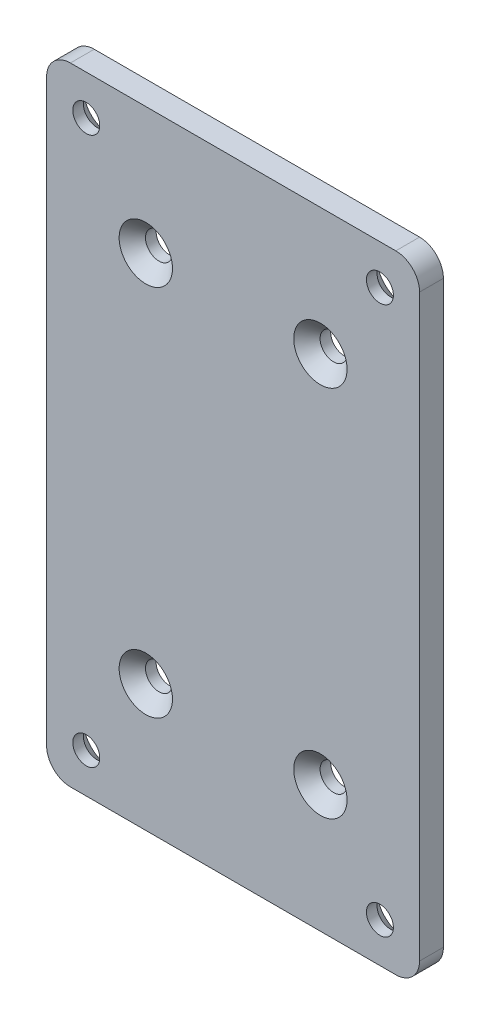
ISO-10303-21;
HEADER;
FILE_DESCRIPTION(('STEP AP214'),'2;1');
FILE_NAME('part.step','',(''),(''),'','','');
FILE_SCHEMA(('AUTOMOTIVE_DESIGN { 1 0 10303 214 1 1 1 1 }'));
ENDSEC;
DATA;
#1=APPLICATION_CONTEXT('core data for automotive mechanical design processes');
#2=APPLICATION_PROTOCOL_DEFINITION('international standard','automotive_design',2000,#1);
#3=PRODUCT_CONTEXT('',#1,'mechanical');
#4=PRODUCT('Part','Part','',(#3));
#5=PRODUCT_RELATED_PRODUCT_CATEGORY('part','',(#4));
#6=PRODUCT_DEFINITION_FORMATION('','',#4);
#7=PRODUCT_DEFINITION_CONTEXT('part definition',#1,'design');
#8=PRODUCT_DEFINITION('design','',#6,#7);
#9=PRODUCT_DEFINITION_SHAPE('','',#8);
#10=(LENGTH_UNIT() NAMED_UNIT(*) SI_UNIT(.MILLI.,.METRE.));
#11=(NAMED_UNIT(*) PLANE_ANGLE_UNIT() SI_UNIT($,.RADIAN.));
#12=(NAMED_UNIT(*) SI_UNIT($,.STERADIAN.) SOLID_ANGLE_UNIT());
#13=UNCERTAINTY_MEASURE_WITH_UNIT(LENGTH_MEASURE(1.E-05),#10,'distance_accuracy_value','');
#14=(GEOMETRIC_REPRESENTATION_CONTEXT(3) GLOBAL_UNCERTAINTY_ASSIGNED_CONTEXT((#13)) GLOBAL_UNIT_ASSIGNED_CONTEXT((#10,
#11,#12)) REPRESENTATION_CONTEXT('',''));
#15=CARTESIAN_POINT('',(0.,0.,0.));
#16=DIRECTION('',(0.,0.,1.));
#17=DIRECTION('',(1.,0.,0.));
#18=AXIS2_PLACEMENT_3D('',#15,#16,#17);
#19=CARTESIAN_POINT('',(23.5,39.5,3.));
#20=DIRECTION('',(-1.,0.,0.));
#21=DIRECTION('',(0.,-1.,0.));
#22=AXIS2_PLACEMENT_3D('',#19,#20,#21);
#23=PLANE('',#22);
#24=DIRECTION('',(0.,1.,0.));
#25=VECTOR('',#24,1.);
#26=CARTESIAN_POINT('',(23.5,39.5,3.));
#27=LINE('',#26,#25);
#28=CARTESIAN_POINT('',(23.5,-36.5,3.));
#29=VERTEX_POINT('',#28);
#30=CARTESIAN_POINT('',(23.5,36.5,3.));
#31=VERTEX_POINT('',#30);
#32=EDGE_CURVE('E129',#29,#31,#27,.T.);
#33=ORIENTED_EDGE('',*,*,#32,.F.);
#34=DIRECTION('',(0.,0.,-1.));
#35=VECTOR('',#34,1.);
#36=CARTESIAN_POINT('',(23.5,-36.5,3.));
#37=LINE('',#36,#35);
#38=CARTESIAN_POINT('',(23.5,-36.5,0.));
#39=VERTEX_POINT('',#38);
#40=EDGE_CURVE('E11',#29,#39,#37,.T.);
#41=ORIENTED_EDGE('',*,*,#40,.T.);
#42=DIRECTION('',(0.,1.,0.));
#43=VECTOR('',#42,1.);
#44=CARTESIAN_POINT('',(23.5,39.5,0.));
#45=LINE('',#44,#43);
#46=CARTESIAN_POINT('',(23.5,36.5,0.));
#47=VERTEX_POINT('',#46);
#48=EDGE_CURVE('E131',#39,#47,#45,.T.);
#49=ORIENTED_EDGE('',*,*,#48,.T.);
#50=DIRECTION('',(0.,0.,-1.));
#51=VECTOR('',#50,1.);
#52=CARTESIAN_POINT('',(23.5,36.5,3.));
#53=LINE('',#52,#51);
#54=EDGE_CURVE('E42',#47,#31,#53,.F.);
#55=ORIENTED_EDGE('',*,*,#54,.T.);
#56=EDGE_LOOP('',(#33,#41,#49,#55));
#57=FACE_BOUND('',#56,.T.);
#58=ADVANCED_FACE('F34',(#57),#23,.F.);
#59=CARTESIAN_POINT('',(-23.5,39.5,3.));
#60=DIRECTION('',(0.,-1.,0.));
#61=DIRECTION('',(0.,0.,-1.));
#62=AXIS2_PLACEMENT_3D('',#59,#60,#61);
#63=PLANE('',#62);
#64=DIRECTION('',(-1.,0.,0.));
#65=VECTOR('',#64,1.);
#66=CARTESIAN_POINT('',(-23.5,39.5,0.));
#67=LINE('',#66,#65);
#68=CARTESIAN_POINT('',(20.5,39.5,0.));
#69=VERTEX_POINT('',#68);
#70=CARTESIAN_POINT('',(-20.5,39.5,0.));
#71=VERTEX_POINT('',#70);
#72=EDGE_CURVE('E127',#69,#71,#67,.T.);
#73=ORIENTED_EDGE('',*,*,#72,.T.);
#74=DIRECTION('',(0.,0.,-1.));
#75=VECTOR('',#74,1.);
#76=CARTESIAN_POINT('',(-20.5,39.5,3.));
#77=LINE('',#76,#75);
#78=CARTESIAN_POINT('',(-20.5,39.5,3.));
#79=VERTEX_POINT('',#78);
#80=EDGE_CURVE('E106',#71,#79,#77,.F.);
#81=ORIENTED_EDGE('',*,*,#80,.T.);
#82=DIRECTION('',(-1.,0.,0.));
#83=VECTOR('',#82,1.);
#84=CARTESIAN_POINT('',(-23.5,39.5,3.));
#85=LINE('',#84,#83);
#86=CARTESIAN_POINT('',(20.5,39.5,3.));
#87=VERTEX_POINT('',#86);
#88=EDGE_CURVE('E167',#87,#79,#85,.T.);
#89=ORIENTED_EDGE('',*,*,#88,.F.);
#90=DIRECTION('',(0.,0.,-1.));
#91=VECTOR('',#90,1.);
#92=CARTESIAN_POINT('',(20.5,39.5,3.));
#93=LINE('',#92,#91);
#94=EDGE_CURVE('E111',#87,#69,#93,.T.);
#95=ORIENTED_EDGE('',*,*,#94,.T.);
#96=EDGE_LOOP('',(#73,#81,#89,#95));
#97=FACE_BOUND('',#96,.T.);
#98=ADVANCED_FACE('F171',(#97),#63,.F.);
#99=CARTESIAN_POINT('',(-23.5,39.5,3.));
#100=DIRECTION('',(1.,0.,0.));
#101=DIRECTION('',(0.,1.,0.));
#102=AXIS2_PLACEMENT_3D('',#99,#100,#101);
#103=PLANE('',#102);
#104=DIRECTION('',(0.,-1.,0.));
#105=VECTOR('',#104,1.);
#106=CARTESIAN_POINT('',(-23.5,39.5,3.));
#107=LINE('',#106,#105);
#108=CARTESIAN_POINT('',(-23.5,36.5,3.));
#109=VERTEX_POINT('',#108);
#110=CARTESIAN_POINT('',(-23.5,-36.5,3.));
#111=VERTEX_POINT('',#110);
#112=EDGE_CURVE('E120',#109,#111,#107,.T.);
#113=ORIENTED_EDGE('',*,*,#112,.F.);
#114=DIRECTION('',(0.,0.,-1.));
#115=VECTOR('',#114,1.);
#116=CARTESIAN_POINT('',(-23.5,36.5,3.));
#117=LINE('',#116,#115);
#118=CARTESIAN_POINT('',(-23.5,36.5,0.));
#119=VERTEX_POINT('',#118);
#120=EDGE_CURVE('E105',#109,#119,#117,.T.);
#121=ORIENTED_EDGE('',*,*,#120,.T.);
#122=DIRECTION('',(0.,-1.,0.));
#123=VECTOR('',#122,1.);
#124=CARTESIAN_POINT('',(-23.5,39.5,0.));
#125=LINE('',#124,#123);
#126=CARTESIAN_POINT('',(-23.5,-36.5,0.));
#127=VERTEX_POINT('',#126);
#128=EDGE_CURVE('E118',#119,#127,#125,.T.);
#129=ORIENTED_EDGE('',*,*,#128,.T.);
#130=DIRECTION('',(0.,0.,-1.));
#131=VECTOR('',#130,1.);
#132=CARTESIAN_POINT('',(-23.5,-36.5,3.));
#133=LINE('',#132,#131);
#134=EDGE_CURVE('E122',#127,#111,#133,.F.);
#135=ORIENTED_EDGE('',*,*,#134,.T.);
#136=EDGE_LOOP('',(#113,#121,#129,#135));
#137=FACE_BOUND('',#136,.T.);
#138=ADVANCED_FACE('F117',(#137),#103,.F.);
#139=CARTESIAN_POINT('',(-23.5,-39.5,3.));
#140=DIRECTION('',(0.,1.,0.));
#141=DIRECTION('',(0.,0.,1.));
#142=AXIS2_PLACEMENT_3D('',#139,#140,#141);
#143=PLANE('',#142);
#144=DIRECTION('',(1.,0.,0.));
#145=VECTOR('',#144,1.);
#146=CARTESIAN_POINT('',(-23.5,-39.5,3.));
#147=LINE('',#146,#145);
#148=CARTESIAN_POINT('',(-20.5,-39.5,3.));
#149=VERTEX_POINT('',#148);
#150=CARTESIAN_POINT('',(20.5,-39.5,3.));
#151=VERTEX_POINT('',#150);
#152=EDGE_CURVE('E135',#149,#151,#147,.T.);
#153=ORIENTED_EDGE('',*,*,#152,.F.);
#154=DIRECTION('',(0.,0.,-1.));
#155=VECTOR('',#154,1.);
#156=CARTESIAN_POINT('',(-20.5,-39.5,3.));
#157=LINE('',#156,#155);
#158=CARTESIAN_POINT('',(-20.5,-39.5,0.));
#159=VERTEX_POINT('',#158);
#160=EDGE_CURVE('E152',#149,#159,#157,.T.);
#161=ORIENTED_EDGE('',*,*,#160,.T.);
#162=DIRECTION('',(1.,0.,0.));
#163=VECTOR('',#162,1.);
#164=CARTESIAN_POINT('',(-23.5,-39.5,0.));
#165=LINE('',#164,#163);
#166=CARTESIAN_POINT('',(20.5,-39.5,0.));
#167=VERTEX_POINT('',#166);
#168=EDGE_CURVE('E126',#159,#167,#165,.T.);
#169=ORIENTED_EDGE('',*,*,#168,.T.);
#170=DIRECTION('',(0.,0.,-1.));
#171=VECTOR('',#170,1.);
#172=CARTESIAN_POINT('',(20.5,-39.5,3.));
#173=LINE('',#172,#171);
#174=EDGE_CURVE('E49',#167,#151,#173,.F.);
#175=ORIENTED_EDGE('',*,*,#174,.T.);
#176=EDGE_LOOP('',(#153,#161,#169,#175));
#177=FACE_BOUND('',#176,.T.);
#178=ADVANCED_FACE('F282',(#177),#143,.F.);
#179=CARTESIAN_POINT('',(0.,0.,3.));
#180=DIRECTION('',(0.,0.,1.));
#181=DIRECTION('',(1.,0.,0.));
#182=AXIS2_PLACEMENT_3D('',#179,#180,#181);
#183=PLANE('',#182);
#184=CARTESIAN_POINT('',(18.5,34.5,3.));
#185=DIRECTION('',(0.,0.,-1.));
#186=DIRECTION('',(-1.,0.,0.));
#187=AXIS2_PLACEMENT_3D('',#184,#185,#186);
#188=CIRCLE('',#187,1.7);
#189=CARTESIAN_POINT('',(16.8,34.5,3.));
#190=VERTEX_POINT('',#189);
#191=EDGE_CURVE('E239',#190,#190,#188,.T.);
#192=ORIENTED_EDGE('',*,*,#191,.T.);
#193=EDGE_LOOP('',(#192));
#194=FACE_BOUND('',#193,.T.);
#195=CARTESIAN_POINT('',(-18.5,34.5,3.));
#196=DIRECTION('',(0.,0.,-1.));
#197=DIRECTION('',(-1.,0.,0.));
#198=AXIS2_PLACEMENT_3D('',#195,#196,#197);
#199=CIRCLE('',#198,1.7);
#200=CARTESIAN_POINT('',(-20.2,34.5,3.));
#201=VERTEX_POINT('',#200);
#202=EDGE_CURVE('E230',#201,#201,#199,.T.);
#203=ORIENTED_EDGE('',*,*,#202,.T.);
#204=EDGE_LOOP('',(#203));
#205=FACE_BOUND('',#204,.T.);
#206=CARTESIAN_POINT('',(18.5,-34.5,3.));
#207=DIRECTION('',(0.,0.,-1.));
#208=DIRECTION('',(-1.,0.,0.));
#209=AXIS2_PLACEMENT_3D('',#206,#207,#208);
#210=CIRCLE('',#209,1.7);
#211=CARTESIAN_POINT('',(16.8,-34.5,3.));
#212=VERTEX_POINT('',#211);
#213=EDGE_CURVE('E221',#212,#212,#210,.T.);
#214=ORIENTED_EDGE('',*,*,#213,.T.);
#215=EDGE_LOOP('',(#214));
#216=FACE_BOUND('',#215,.T.);
#217=CARTESIAN_POINT('',(-18.5,-34.5,3.));
#218=DIRECTION('',(0.,0.,-1.));
#219=DIRECTION('',(-1.,0.,0.));
#220=AXIS2_PLACEMENT_3D('',#217,#218,#219);
#221=CIRCLE('',#220,1.7);
#222=CARTESIAN_POINT('',(-20.2,-34.5,3.));
#223=VERTEX_POINT('',#222);
#224=EDGE_CURVE('E212',#223,#223,#221,.T.);
#225=ORIENTED_EDGE('',*,*,#224,.T.);
#226=EDGE_LOOP('',(#225));
#227=FACE_BOUND('',#226,.T.);
#228=CARTESIAN_POINT('',(-11.,23.5,3.));
#229=DIRECTION('',(0.,0.,1.));
#230=DIRECTION('',(1.,0.,0.));
#231=AXIS2_PLACEMENT_3D('',#228,#229,#230);
#232=CIRCLE('',#231,3.36);
#233=CARTESIAN_POINT('',(-7.64,23.5,3.));
#234=VERTEX_POINT('',#233);
#235=EDGE_CURVE('E209',#234,#234,#232,.T.);
#236=ORIENTED_EDGE('',*,*,#235,.F.);
#237=EDGE_LOOP('',(#236));
#238=FACE_BOUND('',#237,.T.);
#239=CARTESIAN_POINT('',(11.,23.5,3.));
#240=DIRECTION('',(0.,0.,1.));
#241=DIRECTION('',(1.,0.,0.));
#242=AXIS2_PLACEMENT_3D('',#239,#240,#241);
#243=CIRCLE('',#242,3.36);
#244=CARTESIAN_POINT('',(14.36,23.5,3.));
#245=VERTEX_POINT('',#244);
#246=EDGE_CURVE('E200',#245,#245,#243,.T.);
#247=ORIENTED_EDGE('',*,*,#246,.F.);
#248=EDGE_LOOP('',(#247));
#249=FACE_BOUND('',#248,.T.);
#250=CARTESIAN_POINT('',(-11.,-23.5,3.));
#251=DIRECTION('',(0.,0.,1.));
#252=DIRECTION('',(1.,0.,0.));
#253=AXIS2_PLACEMENT_3D('',#250,#251,#252);
#254=CIRCLE('',#253,3.36);
#255=CARTESIAN_POINT('',(-7.64,-23.5,3.));
#256=VERTEX_POINT('',#255);
#257=EDGE_CURVE('E191',#256,#256,#254,.T.);
#258=ORIENTED_EDGE('',*,*,#257,.F.);
#259=EDGE_LOOP('',(#258));
#260=FACE_BOUND('',#259,.T.);
#261=CARTESIAN_POINT('',(11.,-23.5,3.));
#262=DIRECTION('',(0.,0.,1.));
#263=DIRECTION('',(1.,0.,0.));
#264=AXIS2_PLACEMENT_3D('',#261,#262,#263);
#265=CIRCLE('',#264,3.36);
#266=CARTESIAN_POINT('',(14.36,-23.5,3.));
#267=VERTEX_POINT('',#266);
#268=EDGE_CURVE('E182',#267,#267,#265,.T.);
#269=ORIENTED_EDGE('',*,*,#268,.F.);
#270=EDGE_LOOP('',(#269));
#271=FACE_BOUND('',#270,.T.);
#272=ORIENTED_EDGE('',*,*,#88,.T.);
#273=CARTESIAN_POINT('',(-20.5,36.5,3.));
#274=DIRECTION('',(0.,0.,1.));
#275=DIRECTION('',(1.,0.,0.));
#276=AXIS2_PLACEMENT_3D('',#273,#274,#275);
#277=CIRCLE('',#276,3.);
#278=EDGE_CURVE('E149',#79,#109,#277,.T.);
#279=ORIENTED_EDGE('',*,*,#278,.T.);
#280=ORIENTED_EDGE('',*,*,#112,.T.);
#281=CARTESIAN_POINT('',(-20.5,-36.5,3.));
#282=DIRECTION('',(0.,0.,1.));
#283=DIRECTION('',(1.,0.,0.));
#284=AXIS2_PLACEMENT_3D('',#281,#282,#283);
#285=CIRCLE('',#284,3.);
#286=EDGE_CURVE('E56',#111,#149,#285,.T.);
#287=ORIENTED_EDGE('',*,*,#286,.T.);
#288=ORIENTED_EDGE('',*,*,#152,.T.);
#289=CARTESIAN_POINT('',(20.5,-36.5,3.));
#290=DIRECTION('',(0.,0.,1.));
#291=DIRECTION('',(1.,0.,0.));
#292=AXIS2_PLACEMENT_3D('',#289,#290,#291);
#293=CIRCLE('',#292,3.);
#294=EDGE_CURVE('E146',#151,#29,#293,.T.);
#295=ORIENTED_EDGE('',*,*,#294,.T.);
#296=ORIENTED_EDGE('',*,*,#32,.T.);
#297=CARTESIAN_POINT('',(20.5,36.5,3.));
#298=DIRECTION('',(0.,0.,1.));
#299=DIRECTION('',(1.,0.,0.));
#300=AXIS2_PLACEMENT_3D('',#297,#298,#299);
#301=CIRCLE('',#300,3.);
#302=EDGE_CURVE('E144',#31,#87,#301,.T.);
#303=ORIENTED_EDGE('',*,*,#302,.T.);
#304=EDGE_LOOP('',(#272,#279,#280,#287,#288,#295,#296,#303));
#305=FACE_BOUND('',#304,.T.);
#306=ADVANCED_FACE('F164',(#194,#205,#216,#227,#238,#249,#260,#271,#305),#183,.T.);
#307=CARTESIAN_POINT('',(0.,0.,0.));
#308=DIRECTION('',(0.,0.,1.));
#309=DIRECTION('',(1.,0.,0.));
#310=AXIS2_PLACEMENT_3D('',#307,#308,#309);
#311=PLANE('',#310);
#312=CARTESIAN_POINT('',(18.5,34.5,0.));
#313=DIRECTION('',(0.,0.,-1.));
#314=DIRECTION('',(-1.,0.,0.));
#315=AXIS2_PLACEMENT_3D('',#312,#313,#314);
#316=CIRCLE('',#315,3.36);
#317=CARTESIAN_POINT('',(15.14,34.5,0.));
#318=VERTEX_POINT('',#317);
#319=EDGE_CURVE('E245',#318,#318,#316,.T.);
#320=ORIENTED_EDGE('',*,*,#319,.F.);
#321=EDGE_LOOP('',(#320));
#322=FACE_BOUND('',#321,.T.);
#323=CARTESIAN_POINT('',(-18.5,34.5,0.));
#324=DIRECTION('',(0.,0.,-1.));
#325=DIRECTION('',(-1.,0.,0.));
#326=AXIS2_PLACEMENT_3D('',#323,#324,#325);
#327=CIRCLE('',#326,3.36);
#328=CARTESIAN_POINT('',(-21.86,34.5,0.));
#329=VERTEX_POINT('',#328);
#330=EDGE_CURVE('E236',#329,#329,#327,.T.);
#331=ORIENTED_EDGE('',*,*,#330,.F.);
#332=EDGE_LOOP('',(#331));
#333=FACE_BOUND('',#332,.T.);
#334=CARTESIAN_POINT('',(18.5,-34.5,0.));
#335=DIRECTION('',(0.,0.,-1.));
#336=DIRECTION('',(-1.,0.,0.));
#337=AXIS2_PLACEMENT_3D('',#334,#335,#336);
#338=CIRCLE('',#337,3.36);
#339=CARTESIAN_POINT('',(15.14,-34.5,0.));
#340=VERTEX_POINT('',#339);
#341=EDGE_CURVE('E227',#340,#340,#338,.T.);
#342=ORIENTED_EDGE('',*,*,#341,.F.);
#343=EDGE_LOOP('',(#342));
#344=FACE_BOUND('',#343,.T.);
#345=CARTESIAN_POINT('',(-18.5,-34.5,0.));
#346=DIRECTION('',(0.,0.,-1.));
#347=DIRECTION('',(-1.,0.,0.));
#348=AXIS2_PLACEMENT_3D('',#345,#346,#347);
#349=CIRCLE('',#348,3.36);
#350=CARTESIAN_POINT('',(-21.86,-34.5,0.));
#351=VERTEX_POINT('',#350);
#352=EDGE_CURVE('E218',#351,#351,#349,.T.);
#353=ORIENTED_EDGE('',*,*,#352,.F.);
#354=EDGE_LOOP('',(#353));
#355=FACE_BOUND('',#354,.T.);
#356=CARTESIAN_POINT('',(-11.,23.5,0.));
#357=DIRECTION('',(0.,0.,1.));
#358=DIRECTION('',(1.,0.,0.));
#359=AXIS2_PLACEMENT_3D('',#356,#357,#358);
#360=CIRCLE('',#359,1.7);
#361=CARTESIAN_POINT('',(-9.3,23.5,0.));
#362=VERTEX_POINT('',#361);
#363=EDGE_CURVE('E203',#362,#362,#360,.T.);
#364=ORIENTED_EDGE('',*,*,#363,.T.);
#365=EDGE_LOOP('',(#364));
#366=FACE_BOUND('',#365,.T.);
#367=CARTESIAN_POINT('',(11.,23.5,0.));
#368=DIRECTION('',(0.,0.,1.));
#369=DIRECTION('',(1.,0.,0.));
#370=AXIS2_PLACEMENT_3D('',#367,#368,#369);
#371=CIRCLE('',#370,1.7);
#372=CARTESIAN_POINT('',(12.7,23.5,0.));
#373=VERTEX_POINT('',#372);
#374=EDGE_CURVE('E194',#373,#373,#371,.T.);
#375=ORIENTED_EDGE('',*,*,#374,.T.);
#376=EDGE_LOOP('',(#375));
#377=FACE_BOUND('',#376,.T.);
#378=CARTESIAN_POINT('',(-11.,-23.5,0.));
#379=DIRECTION('',(0.,0.,1.));
#380=DIRECTION('',(1.,0.,0.));
#381=AXIS2_PLACEMENT_3D('',#378,#379,#380);
#382=CIRCLE('',#381,1.7);
#383=CARTESIAN_POINT('',(-9.3,-23.5,0.));
#384=VERTEX_POINT('',#383);
#385=EDGE_CURVE('E185',#384,#384,#382,.T.);
#386=ORIENTED_EDGE('',*,*,#385,.T.);
#387=EDGE_LOOP('',(#386));
#388=FACE_BOUND('',#387,.T.);
#389=CARTESIAN_POINT('',(11.,-23.5,0.));
#390=DIRECTION('',(0.,0.,1.));
#391=DIRECTION('',(1.,0.,0.));
#392=AXIS2_PLACEMENT_3D('',#389,#390,#391);
#393=CIRCLE('',#392,1.7);
#394=CARTESIAN_POINT('',(12.7,-23.5,0.));
#395=VERTEX_POINT('',#394);
#396=EDGE_CURVE('E172',#395,#395,#393,.T.);
#397=ORIENTED_EDGE('',*,*,#396,.T.);
#398=EDGE_LOOP('',(#397));
#399=FACE_BOUND('',#398,.T.);
#400=ORIENTED_EDGE('',*,*,#128,.F.);
#401=CARTESIAN_POINT('',(-20.5,36.5,0.));
#402=DIRECTION('',(0.,0.,1.));
#403=DIRECTION('',(1.,0.,0.));
#404=AXIS2_PLACEMENT_3D('',#401,#402,#403);
#405=CIRCLE('',#404,3.);
#406=EDGE_CURVE('E101',#119,#71,#405,.F.);
#407=ORIENTED_EDGE('',*,*,#406,.T.);
#408=ORIENTED_EDGE('',*,*,#72,.F.);
#409=CARTESIAN_POINT('',(20.5,36.5,0.));
#410=DIRECTION('',(0.,0.,1.));
#411=DIRECTION('',(1.,0.,0.));
#412=AXIS2_PLACEMENT_3D('',#409,#410,#411);
#413=CIRCLE('',#412,3.);
#414=EDGE_CURVE('E121',#69,#47,#413,.F.);
#415=ORIENTED_EDGE('',*,*,#414,.T.);
#416=ORIENTED_EDGE('',*,*,#48,.F.);
#417=CARTESIAN_POINT('',(20.5,-36.5,0.));
#418=DIRECTION('',(0.,0.,1.));
#419=DIRECTION('',(1.,0.,0.));
#420=AXIS2_PLACEMENT_3D('',#417,#418,#419);
#421=CIRCLE('',#420,3.);
#422=EDGE_CURVE('E138',#39,#167,#421,.F.);
#423=ORIENTED_EDGE('',*,*,#422,.T.);
#424=ORIENTED_EDGE('',*,*,#168,.F.);
#425=CARTESIAN_POINT('',(-20.5,-36.5,0.));
#426=DIRECTION('',(0.,0.,1.));
#427=DIRECTION('',(1.,0.,0.));
#428=AXIS2_PLACEMENT_3D('',#425,#426,#427);
#429=CIRCLE('',#428,3.);
#430=EDGE_CURVE('E112',#159,#127,#429,.F.);
#431=ORIENTED_EDGE('',*,*,#430,.T.);
#432=EDGE_LOOP('',(#400,#407,#408,#415,#416,#423,#424,#431));
#433=FACE_BOUND('',#432,.T.);
#434=ADVANCED_FACE('F124',(#322,#333,#344,#355,#366,#377,#388,#399,#433),#311,.F.);
#435=CARTESIAN_POINT('',(11.,-23.5,3.));
#436=DIRECTION('',(0.,0.,1.));
#437=DIRECTION('',(1.,0.,0.));
#438=AXIS2_PLACEMENT_3D('',#435,#436,#437);
#439=CYLINDRICAL_SURFACE('',#438,1.69999999999999);
#440=ORIENTED_EDGE('',*,*,#396,.F.);
#441=EDGE_LOOP('',(#440));
#442=FACE_BOUND('',#441,.T.);
#443=CARTESIAN_POINT('',(11.,-23.5,1.33999999999998));
#444=DIRECTION('',(0.,0.,1.));
#445=DIRECTION('',(1.,0.,0.));
#446=AXIS2_PLACEMENT_3D('',#443,#444,#445);
#447=CIRCLE('',#446,1.69999999999999);
#448=CARTESIAN_POINT('',(12.7,-23.5,1.33999999999998));
#449=VERTEX_POINT('',#448);
#450=EDGE_CURVE('E174',#449,#449,#447,.T.);
#451=ORIENTED_EDGE('',*,*,#450,.T.);
#452=EDGE_LOOP('',(#451));
#453=FACE_BOUND('',#452,.T.);
#454=ADVANCED_FACE('F253',(#442,#453),#439,.F.);
#455=CARTESIAN_POINT('',(11.,-23.5,3.));
#456=DIRECTION('',(0.,0.,1.));
#457=DIRECTION('',(1.,0.,0.));
#458=AXIS2_PLACEMENT_3D('',#455,#456,#457);
#459=CONICAL_SURFACE('',#458,3.36,0.785398163397445);
#460=ORIENTED_EDGE('',*,*,#450,.F.);
#461=EDGE_LOOP('',(#460));
#462=FACE_BOUND('',#461,.T.);
#463=ORIENTED_EDGE('',*,*,#268,.T.);
#464=EDGE_LOOP('',(#463));
#465=FACE_BOUND('',#464,.T.);
#466=ADVANCED_FACE('F271',(#462,#465),#459,.F.);
#467=CARTESIAN_POINT('',(-11.,-23.5,3.));
#468=DIRECTION('',(0.,0.,1.));
#469=DIRECTION('',(1.,0.,0.));
#470=AXIS2_PLACEMENT_3D('',#467,#468,#469);
#471=CYLINDRICAL_SURFACE('',#470,1.69999999999999);
#472=ORIENTED_EDGE('',*,*,#385,.F.);
#473=EDGE_LOOP('',(#472));
#474=FACE_BOUND('',#473,.T.);
#475=CARTESIAN_POINT('',(-11.,-23.5,1.33999999999998));
#476=DIRECTION('',(0.,0.,1.));
#477=DIRECTION('',(1.,0.,0.));
#478=AXIS2_PLACEMENT_3D('',#475,#476,#477);
#479=CIRCLE('',#478,1.69999999999999);
#480=CARTESIAN_POINT('',(-9.30000000000001,-23.5,1.33999999999998));
#481=VERTEX_POINT('',#480);
#482=EDGE_CURVE('E188',#481,#481,#479,.T.);
#483=ORIENTED_EDGE('',*,*,#482,.T.);
#484=EDGE_LOOP('',(#483));
#485=FACE_BOUND('',#484,.T.);
#486=ADVANCED_FACE('F277',(#474,#485),#471,.F.);
#487=CARTESIAN_POINT('',(-11.,-23.5,3.));
#488=DIRECTION('',(0.,0.,1.));
#489=DIRECTION('',(1.,0.,0.));
#490=AXIS2_PLACEMENT_3D('',#487,#488,#489);
#491=CONICAL_SURFACE('',#490,3.36,0.785398163397445);
#492=ORIENTED_EDGE('',*,*,#482,.F.);
#493=EDGE_LOOP('',(#492));
#494=FACE_BOUND('',#493,.T.);
#495=ORIENTED_EDGE('',*,*,#257,.T.);
#496=EDGE_LOOP('',(#495));
#497=FACE_BOUND('',#496,.T.);
#498=ADVANCED_FACE('F480',(#494,#497),#491,.F.);
#499=CARTESIAN_POINT('',(11.,23.5,3.));
#500=DIRECTION('',(0.,0.,1.));
#501=DIRECTION('',(1.,0.,0.));
#502=AXIS2_PLACEMENT_3D('',#499,#500,#501);
#503=CYLINDRICAL_SURFACE('',#502,1.69999999999999);
#504=ORIENTED_EDGE('',*,*,#374,.F.);
#505=EDGE_LOOP('',(#504));
#506=FACE_BOUND('',#505,.T.);
#507=CARTESIAN_POINT('',(11.,23.5,1.33999999999998));
#508=DIRECTION('',(0.,0.,1.));
#509=DIRECTION('',(1.,0.,0.));
#510=AXIS2_PLACEMENT_3D('',#507,#508,#509);
#511=CIRCLE('',#510,1.69999999999999);
#512=CARTESIAN_POINT('',(12.7,23.5,1.33999999999998));
#513=VERTEX_POINT('',#512);
#514=EDGE_CURVE('E197',#513,#513,#511,.T.);
#515=ORIENTED_EDGE('',*,*,#514,.T.);
#516=EDGE_LOOP('',(#515));
#517=FACE_BOUND('',#516,.T.);
#518=ADVANCED_FACE('F470',(#506,#517),#503,.F.);
#519=CARTESIAN_POINT('',(11.,23.5,3.));
#520=DIRECTION('',(0.,0.,1.));
#521=DIRECTION('',(1.,0.,0.));
#522=AXIS2_PLACEMENT_3D('',#519,#520,#521);
#523=CONICAL_SURFACE('',#522,3.36,0.785398163397445);
#524=ORIENTED_EDGE('',*,*,#514,.F.);
#525=EDGE_LOOP('',(#524));
#526=FACE_BOUND('',#525,.T.);
#527=ORIENTED_EDGE('',*,*,#246,.T.);
#528=EDGE_LOOP('',(#527));
#529=FACE_BOUND('',#528,.T.);
#530=ADVANCED_FACE('F460',(#526,#529),#523,.F.);
#531=CARTESIAN_POINT('',(-11.,23.5,3.));
#532=DIRECTION('',(0.,0.,1.));
#533=DIRECTION('',(1.,0.,0.));
#534=AXIS2_PLACEMENT_3D('',#531,#532,#533);
#535=CYLINDRICAL_SURFACE('',#534,1.69999999999999);
#536=ORIENTED_EDGE('',*,*,#363,.F.);
#537=EDGE_LOOP('',(#536));
#538=FACE_BOUND('',#537,.T.);
#539=CARTESIAN_POINT('',(-11.,23.5,1.33999999999998));
#540=DIRECTION('',(0.,0.,1.));
#541=DIRECTION('',(1.,0.,0.));
#542=AXIS2_PLACEMENT_3D('',#539,#540,#541);
#543=CIRCLE('',#542,1.69999999999999);
#544=CARTESIAN_POINT('',(-9.30000000000001,23.5,1.33999999999998));
#545=VERTEX_POINT('',#544);
#546=EDGE_CURVE('E206',#545,#545,#543,.T.);
#547=ORIENTED_EDGE('',*,*,#546,.T.);
#548=EDGE_LOOP('',(#547));
#549=FACE_BOUND('',#548,.T.);
#550=ADVANCED_FACE('F450',(#538,#549),#535,.F.);
#551=CARTESIAN_POINT('',(-11.,23.5,3.));
#552=DIRECTION('',(0.,0.,1.));
#553=DIRECTION('',(1.,0.,0.));
#554=AXIS2_PLACEMENT_3D('',#551,#552,#553);
#555=CONICAL_SURFACE('',#554,3.36,0.785398163397445);
#556=ORIENTED_EDGE('',*,*,#546,.F.);
#557=EDGE_LOOP('',(#556));
#558=FACE_BOUND('',#557,.T.);
#559=ORIENTED_EDGE('',*,*,#235,.T.);
#560=EDGE_LOOP('',(#559));
#561=FACE_BOUND('',#560,.T.);
#562=ADVANCED_FACE('F440',(#558,#561),#555,.F.);
#563=CARTESIAN_POINT('',(-18.5,-34.5,0.));
#564=DIRECTION('',(0.,0.,-1.));
#565=DIRECTION('',(-1.,0.,0.));
#566=AXIS2_PLACEMENT_3D('',#563,#564,#565);
#567=CYLINDRICAL_SURFACE('',#566,1.69999999999999);
#568=ORIENTED_EDGE('',*,*,#224,.F.);
#569=EDGE_LOOP('',(#568));
#570=FACE_BOUND('',#569,.T.);
#571=CARTESIAN_POINT('',(-18.5,-34.5,1.66000000000002));
#572=DIRECTION('',(0.,0.,-1.));
#573=DIRECTION('',(-1.,0.,0.));
#574=AXIS2_PLACEMENT_3D('',#571,#572,#573);
#575=CIRCLE('',#574,1.69999999999999);
#576=CARTESIAN_POINT('',(-20.2,-34.5,1.66000000000002));
#577=VERTEX_POINT('',#576);
#578=EDGE_CURVE('E215',#577,#577,#575,.T.);
#579=ORIENTED_EDGE('',*,*,#578,.T.);
#580=EDGE_LOOP('',(#579));
#581=FACE_BOUND('',#580,.T.);
#582=ADVANCED_FACE('F430',(#570,#581),#567,.F.);
#583=CARTESIAN_POINT('',(-18.5,-34.5,0.));
#584=DIRECTION('',(0.,0.,-1.));
#585=DIRECTION('',(-1.,0.,0.));
#586=AXIS2_PLACEMENT_3D('',#583,#584,#585);
#587=CONICAL_SURFACE('',#586,3.36,0.785398163397444);
#588=ORIENTED_EDGE('',*,*,#578,.F.);
#589=EDGE_LOOP('',(#588));
#590=FACE_BOUND('',#589,.T.);
#591=ORIENTED_EDGE('',*,*,#352,.T.);
#592=EDGE_LOOP('',(#591));
#593=FACE_BOUND('',#592,.T.);
#594=ADVANCED_FACE('F420',(#590,#593),#587,.F.);
#595=CARTESIAN_POINT('',(18.5,-34.5,0.));
#596=DIRECTION('',(0.,0.,-1.));
#597=DIRECTION('',(-1.,0.,0.));
#598=AXIS2_PLACEMENT_3D('',#595,#596,#597);
#599=CYLINDRICAL_SURFACE('',#598,1.69999999999999);
#600=ORIENTED_EDGE('',*,*,#213,.F.);
#601=EDGE_LOOP('',(#600));
#602=FACE_BOUND('',#601,.T.);
#603=CARTESIAN_POINT('',(18.5,-34.5,1.66000000000002));
#604=DIRECTION('',(0.,0.,-1.));
#605=DIRECTION('',(-1.,0.,0.));
#606=AXIS2_PLACEMENT_3D('',#603,#604,#605);
#607=CIRCLE('',#606,1.69999999999999);
#608=CARTESIAN_POINT('',(16.8,-34.5,1.66000000000002));
#609=VERTEX_POINT('',#608);
#610=EDGE_CURVE('E224',#609,#609,#607,.T.);
#611=ORIENTED_EDGE('',*,*,#610,.T.);
#612=EDGE_LOOP('',(#611));
#613=FACE_BOUND('',#612,.T.);
#614=ADVANCED_FACE('F410',(#602,#613),#599,.F.);
#615=CARTESIAN_POINT('',(18.5,-34.5,0.));
#616=DIRECTION('',(0.,0.,-1.));
#617=DIRECTION('',(-1.,0.,0.));
#618=AXIS2_PLACEMENT_3D('',#615,#616,#617);
#619=CONICAL_SURFACE('',#618,3.36,0.785398163397446);
#620=ORIENTED_EDGE('',*,*,#610,.F.);
#621=EDGE_LOOP('',(#620));
#622=FACE_BOUND('',#621,.T.);
#623=ORIENTED_EDGE('',*,*,#341,.T.);
#624=EDGE_LOOP('',(#623));
#625=FACE_BOUND('',#624,.T.);
#626=ADVANCED_FACE('F400',(#622,#625),#619,.F.);
#627=CARTESIAN_POINT('',(-18.5,34.5,0.));
#628=DIRECTION('',(0.,0.,-1.));
#629=DIRECTION('',(-1.,0.,0.));
#630=AXIS2_PLACEMENT_3D('',#627,#628,#629);
#631=CYLINDRICAL_SURFACE('',#630,1.69999999999999);
#632=ORIENTED_EDGE('',*,*,#202,.F.);
#633=EDGE_LOOP('',(#632));
#634=FACE_BOUND('',#633,.T.);
#635=CARTESIAN_POINT('',(-18.5,34.5,1.66000000000002));
#636=DIRECTION('',(0.,0.,-1.));
#637=DIRECTION('',(-1.,0.,0.));
#638=AXIS2_PLACEMENT_3D('',#635,#636,#637);
#639=CIRCLE('',#638,1.69999999999999);
#640=CARTESIAN_POINT('',(-20.2,34.5,1.66000000000002));
#641=VERTEX_POINT('',#640);
#642=EDGE_CURVE('E233',#641,#641,#639,.T.);
#643=ORIENTED_EDGE('',*,*,#642,.T.);
#644=EDGE_LOOP('',(#643));
#645=FACE_BOUND('',#644,.T.);
#646=ADVANCED_FACE('F390',(#634,#645),#631,.F.);
#647=CARTESIAN_POINT('',(-18.5,34.5,0.));
#648=DIRECTION('',(0.,0.,-1.));
#649=DIRECTION('',(-1.,0.,0.));
#650=AXIS2_PLACEMENT_3D('',#647,#648,#649);
#651=CONICAL_SURFACE('',#650,3.36,0.785398163397445);
#652=ORIENTED_EDGE('',*,*,#642,.F.);
#653=EDGE_LOOP('',(#652));
#654=FACE_BOUND('',#653,.T.);
#655=ORIENTED_EDGE('',*,*,#330,.T.);
#656=EDGE_LOOP('',(#655));
#657=FACE_BOUND('',#656,.T.);
#658=ADVANCED_FACE('F380',(#654,#657),#651,.F.);
#659=CARTESIAN_POINT('',(18.5,34.5,0.));
#660=DIRECTION('',(0.,0.,-1.));
#661=DIRECTION('',(-1.,0.,0.));
#662=AXIS2_PLACEMENT_3D('',#659,#660,#661);
#663=CYLINDRICAL_SURFACE('',#662,1.69999999999999);
#664=ORIENTED_EDGE('',*,*,#191,.F.);
#665=EDGE_LOOP('',(#664));
#666=FACE_BOUND('',#665,.T.);
#667=CARTESIAN_POINT('',(18.5,34.5,1.66000000000002));
#668=DIRECTION('',(0.,0.,-1.));
#669=DIRECTION('',(-1.,0.,0.));
#670=AXIS2_PLACEMENT_3D('',#667,#668,#669);
#671=CIRCLE('',#670,1.69999999999999);
#672=CARTESIAN_POINT('',(16.8,34.5,1.66000000000002));
#673=VERTEX_POINT('',#672);
#674=EDGE_CURVE('E242',#673,#673,#671,.T.);
#675=ORIENTED_EDGE('',*,*,#674,.T.);
#676=EDGE_LOOP('',(#675));
#677=FACE_BOUND('',#676,.T.);
#678=ADVANCED_FACE('F370',(#666,#677),#663,.F.);
#679=CARTESIAN_POINT('',(18.5,34.5,0.));
#680=DIRECTION('',(0.,0.,-1.));
#681=DIRECTION('',(-1.,0.,0.));
#682=AXIS2_PLACEMENT_3D('',#679,#680,#681);
#683=CONICAL_SURFACE('',#682,3.36,0.785398163397446);
#684=ORIENTED_EDGE('',*,*,#674,.F.);
#685=EDGE_LOOP('',(#684));
#686=FACE_BOUND('',#685,.T.);
#687=ORIENTED_EDGE('',*,*,#319,.T.);
#688=EDGE_LOOP('',(#687));
#689=FACE_BOUND('',#688,.T.);
#690=ADVANCED_FACE('F249',(#686,#689),#683,.F.);
#691=CARTESIAN_POINT('',(-20.5,36.5,3.));
#692=DIRECTION('',(0.,0.,-1.));
#693=DIRECTION('',(-1.,0.,0.));
#694=AXIS2_PLACEMENT_3D('',#691,#692,#693);
#695=CYLINDRICAL_SURFACE('',#694,3.);
#696=ORIENTED_EDGE('',*,*,#278,.F.);
#697=ORIENTED_EDGE('',*,*,#80,.F.);
#698=ORIENTED_EDGE('',*,*,#406,.F.);
#699=ORIENTED_EDGE('',*,*,#120,.F.);
#700=EDGE_LOOP('',(#696,#697,#698,#699));
#701=FACE_BOUND('',#700,.T.);
#702=ADVANCED_FACE('F104',(#701),#695,.T.);
#703=CARTESIAN_POINT('',(-20.5,-36.5,3.));
#704=DIRECTION('',(0.,0.,-1.));
#705=DIRECTION('',(-1.,0.,0.));
#706=AXIS2_PLACEMENT_3D('',#703,#704,#705);
#707=CYLINDRICAL_SURFACE('',#706,3.);
#708=ORIENTED_EDGE('',*,*,#286,.F.);
#709=ORIENTED_EDGE('',*,*,#134,.F.);
#710=ORIENTED_EDGE('',*,*,#430,.F.);
#711=ORIENTED_EDGE('',*,*,#160,.F.);
#712=EDGE_LOOP('',(#708,#709,#710,#711));
#713=FACE_BOUND('',#712,.T.);
#714=ADVANCED_FACE('F300',(#713),#707,.T.);
#715=CARTESIAN_POINT('',(20.5,-36.5,3.));
#716=DIRECTION('',(0.,0.,-1.));
#717=DIRECTION('',(-1.,0.,0.));
#718=AXIS2_PLACEMENT_3D('',#715,#716,#717);
#719=CYLINDRICAL_SURFACE('',#718,3.);
#720=ORIENTED_EDGE('',*,*,#294,.F.);
#721=ORIENTED_EDGE('',*,*,#174,.F.);
#722=ORIENTED_EDGE('',*,*,#422,.F.);
#723=ORIENTED_EDGE('',*,*,#40,.F.);
#724=EDGE_LOOP('',(#720,#721,#722,#723));
#725=FACE_BOUND('',#724,.T.);
#726=ADVANCED_FACE('F302',(#725),#719,.T.);
#727=CARTESIAN_POINT('',(20.5,36.5,3.));
#728=DIRECTION('',(0.,0.,-1.));
#729=DIRECTION('',(-1.,0.,0.));
#730=AXIS2_PLACEMENT_3D('',#727,#728,#729);
#731=CYLINDRICAL_SURFACE('',#730,3.);
#732=ORIENTED_EDGE('',*,*,#302,.F.);
#733=ORIENTED_EDGE('',*,*,#54,.F.);
#734=ORIENTED_EDGE('',*,*,#414,.F.);
#735=ORIENTED_EDGE('',*,*,#94,.F.);
#736=EDGE_LOOP('',(#732,#733,#734,#735));
#737=FACE_BOUND('',#736,.T.);
#738=ADVANCED_FACE('F36',(#737),#731,.T.);
#739=CLOSED_SHELL('',(#58,#98,#138,#178,#306,#434,#454,#466,#486,#498,#518,#530,#550,#562,#582,
#594,#614,#626,#646,#658,#678,#690,#702,#714,#726,#738));
#740=MANIFOLD_SOLID_BREP('B2',#739);
#741=ADVANCED_BREP_SHAPE_REPRESENTATION('',(#18,#740),#14);
#742=SHAPE_DEFINITION_REPRESENTATION(#9,#741);
ENDSEC;
END-ISO-10303-21;
